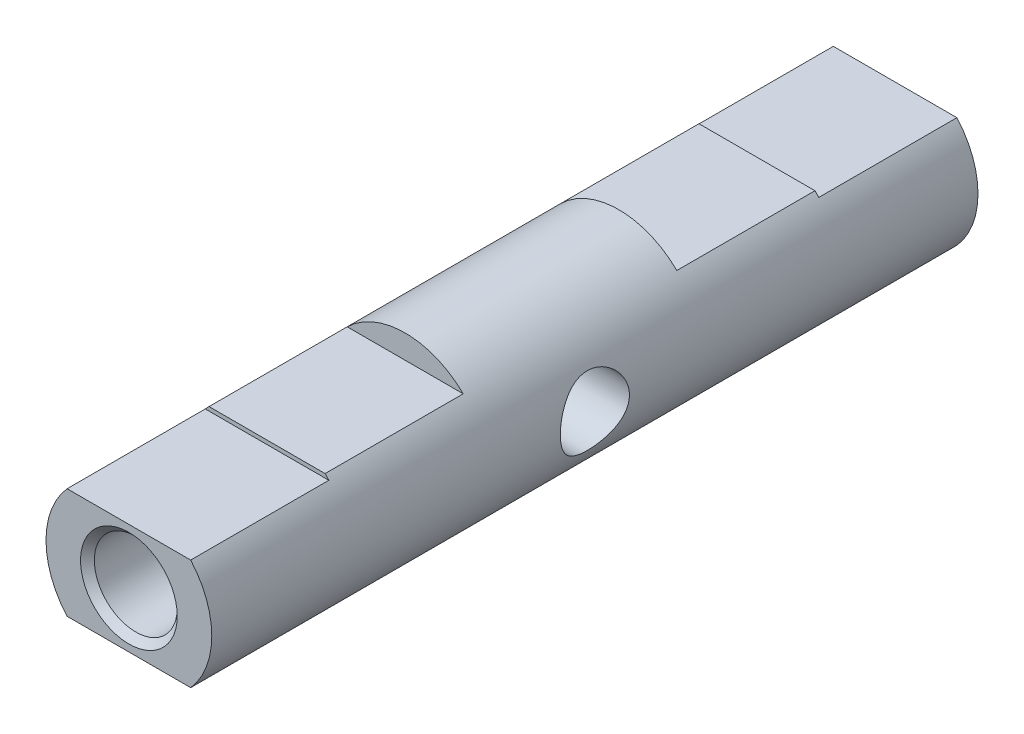
ISO-10303-21;
HEADER;
FILE_DESCRIPTION(('STEP AP214'),'2;1');
FILE_NAME('part.step','',(''),(''),'','','');
FILE_SCHEMA(('AUTOMOTIVE_DESIGN { 1 0 10303 214 1 1 1 1 }'));
ENDSEC;
DATA;
#1=APPLICATION_CONTEXT('core data for automotive mechanical design processes');
#2=APPLICATION_PROTOCOL_DEFINITION('international standard','automotive_design',2000,#1);
#3=PRODUCT_CONTEXT('',#1,'mechanical');
#4=PRODUCT('Part','Part','',(#3));
#5=PRODUCT_RELATED_PRODUCT_CATEGORY('part','',(#4));
#6=PRODUCT_DEFINITION_FORMATION('','',#4);
#7=PRODUCT_DEFINITION_CONTEXT('part definition',#1,'design');
#8=PRODUCT_DEFINITION('design','',#6,#7);
#9=PRODUCT_DEFINITION_SHAPE('','',#8);
#10=(LENGTH_UNIT() NAMED_UNIT(*) SI_UNIT(.MILLI.,.METRE.));
#11=(NAMED_UNIT(*) PLANE_ANGLE_UNIT() SI_UNIT($,.RADIAN.));
#12=(NAMED_UNIT(*) SI_UNIT($,.STERADIAN.) SOLID_ANGLE_UNIT());
#13=UNCERTAINTY_MEASURE_WITH_UNIT(LENGTH_MEASURE(1.E-05),#10,'distance_accuracy_value','');
#14=(GEOMETRIC_REPRESENTATION_CONTEXT(3) GLOBAL_UNCERTAINTY_ASSIGNED_CONTEXT((#13)) GLOBAL_UNIT_ASSIGNED_CONTEXT((#10,
#11,#12)) REPRESENTATION_CONTEXT('',''));
#15=CARTESIAN_POINT('',(0.,0.,0.));
#16=DIRECTION('',(0.,0.,1.));
#17=DIRECTION('',(1.,0.,0.));
#18=AXIS2_PLACEMENT_3D('',#15,#16,#17);
#19=CARTESIAN_POINT('',(0.,0.,-13.865));
#20=DIRECTION('',(0.,0.,1.));
#21=DIRECTION('',(1.,0.,0.));
#22=AXIS2_PLACEMENT_3D('',#19,#20,#21);
#23=CYLINDRICAL_SURFACE('',#22,3.);
#24=CARTESIAN_POINT('',(3.,0.,1.25));
#25=CARTESIAN_POINT('',(2.99999458367273,-0.0669580526362669,1.2499927949087));
#26=CARTESIAN_POINT('',(2.9977323297471,-0.134021397063841,1.24458804147187));
#27=CARTESIAN_POINT('',(2.98890153579552,-0.266247371156347,1.22316093507982));
#28=CARTESIAN_POINT('',(2.98232175901028,-0.331404576423565,1.20711087553575));
#29=CARTESIAN_POINT('',(2.96556289038127,-0.457688733653088,1.16508890821941));
#30=CARTESIAN_POINT('',(2.95539599975003,-0.518828524426269,1.13915061053185));
#31=CARTESIAN_POINT('',(2.93245286470664,-0.635829756679803,1.07822717676743));
#32=CARTESIAN_POINT('',(2.91967741092849,-0.69169279001594,1.04324478102913));
#33=CARTESIAN_POINT('',(2.89207828351869,-0.799448403559513,0.96337101740912));
#34=CARTESIAN_POINT('',(2.87718753326093,-0.851041267517769,0.918098691210248));
#35=CARTESIAN_POINT('',(2.84732714068513,-0.946159821091263,0.819735665217431));
#36=CARTESIAN_POINT('',(2.83235746106809,-0.989681263153086,0.766640875105494));
#37=CARTESIAN_POINT('',(2.80321021812995,-1.06953737697066,0.650973222435106));
#38=CARTESIAN_POINT('',(2.78910786873385,-1.10541308153925,0.588062551573457));
#39=CARTESIAN_POINT('',(2.76435572357005,-1.16593940588866,0.45642674207907));
#40=CARTESIAN_POINT('',(2.75370415000823,-1.19059580836291,0.387704620515548));
#41=CARTESIAN_POINT('',(2.73778555387705,-1.22674598312159,0.24984630823208));
#42=CARTESIAN_POINT('',(2.73228387651787,-1.23881657877606,0.180889516607846));
#43=CARTESIAN_POINT('',(2.72661326219504,-1.25125209967796,0.0417267073134295));
#44=CARTESIAN_POINT('',(2.72644138425259,-1.25162348054397,-0.0284786000257398));
#45=CARTESIAN_POINT('',(2.73125119560852,-1.24108450363674,-0.162400060434938));
#46=CARTESIAN_POINT('',(2.73583882723623,-1.23103681112301,-0.226201096564462));
#47=CARTESIAN_POINT('',(2.74898482773796,-1.20139191015777,-0.35111209100039));
#48=CARTESIAN_POINT('',(2.75754395703563,-1.18179287287177,-0.412221531491773));
#49=CARTESIAN_POINT('',(2.77786184772756,-1.13321958727571,-0.531557702991443));
#50=CARTESIAN_POINT('',(2.78968481949136,-1.10405471539236,-0.58969542091338));
#51=CARTESIAN_POINT('',(2.81518331141086,-1.03731242580562,-0.700477733880146));
#52=CARTESIAN_POINT('',(2.82885956129779,-0.999731690519545,-0.753120150613518));
#53=CARTESIAN_POINT('',(2.85792976877979,-0.913495965543836,-0.856099958732839));
#54=CARTESIAN_POINT('',(2.87337121404473,-0.864173483207527,-0.905866567385436));
#55=CARTESIAN_POINT('',(2.90325673112529,-0.757729591051513,-0.996613502959182));
#56=CARTESIAN_POINT('',(2.9177005687701,-0.700606359448458,-1.03759177169218));
#57=CARTESIAN_POINT('',(2.94438283556473,-0.578447948693377,-1.11043582361627));
#58=CARTESIAN_POINT('',(2.95656266543333,-0.513260582447681,-1.14206944515068));
#59=CARTESIAN_POINT('',(2.97689481414803,-0.377852402526832,-1.19372113960326));
#60=CARTESIAN_POINT('',(2.985049358458,-0.307634394795036,-1.21374563194382));
#61=CARTESIAN_POINT('',(2.99599641186385,-0.168928113346229,-1.24041599212664));
#62=CARTESIAN_POINT('',(2.99909541047125,-0.10061128527864,-1.24782785744375));
#63=CARTESIAN_POINT('',(3.00056050368745,0.0363546554960889,-1.25134622361409));
#64=CARTESIAN_POINT('',(2.99892795711939,0.105003667152635,-1.247455970252));
#65=CARTESIAN_POINT('',(2.9913121765694,0.237098242341435,-1.22902891519393));
#66=CARTESIAN_POINT('',(2.98554887283989,0.300632966639387,-1.2150300459028));
#67=CARTESIAN_POINT('',(2.97048606772414,0.424382748971091,-1.17753180545922));
#68=CARTESIAN_POINT('',(2.96118611959704,0.484597386518361,-1.1540312340497));
#69=CARTESIAN_POINT('',(2.93958270645166,0.602108999869137,-1.09742902428788));
#70=CARTESIAN_POINT('',(2.92719491469281,0.659257236855324,-1.06405181685397));
#71=CARTESIAN_POINT('',(2.9007380457909,0.76734621623143,-0.988946622208306));
#72=CARTESIAN_POINT('',(2.88666826768733,0.818284352601942,-0.947215148470727));
#73=CARTESIAN_POINT('',(2.85712087895437,0.916333430274265,-0.853096766727593));
#74=CARTESIAN_POINT('',(2.84161451591029,0.962910697979836,-0.80016149701374));
#75=CARTESIAN_POINT('',(2.81184336768005,1.04666984610551,-0.686978724064608));
#76=CARTESIAN_POINT('',(2.79757886493438,1.08384959285617,-0.626729564828267));
#77=CARTESIAN_POINT('',(2.77181386243988,1.14815960208699,-0.499385824697424));
#78=CARTESIAN_POINT('',(2.76035562555111,1.17513918237329,-0.43220596448517));
#79=CARTESIAN_POINT('',(2.74208355658957,1.21717413951573,-0.293629406189895));
#80=CARTESIAN_POINT('',(2.73526589555752,1.23223934863688,-0.222236237516652));
#81=CARTESIAN_POINT('',(2.72763164537264,1.24904080348901,-0.0831813008007906));
#82=CARTESIAN_POINT('',(2.72639350967162,1.25171380413129,-0.0156553377073847));
#83=CARTESIAN_POINT('',(2.72893853011024,1.24615575523912,0.118842861141101));
#84=CARTESIAN_POINT('',(2.73272091540306,1.23792637964722,0.185815180313694));
#85=CARTESIAN_POINT('',(2.74449551302268,1.21158404780491,0.31409274746889));
#86=CARTESIAN_POINT('',(2.7522835484648,1.19394903571466,0.375516673463392));
#87=CARTESIAN_POINT('',(2.77103181199189,1.14976328202135,0.494548021357227));
#88=CARTESIAN_POINT('',(2.78199293131693,1.12321003517252,0.552154365398783));
#89=CARTESIAN_POINT('',(2.80666954560013,1.0601028593549,0.665695895949123));
#90=CARTESIAN_POINT('',(2.82051102713679,1.02304360910483,0.72132233016829));
#91=CARTESIAN_POINT('',(2.84903689053839,0.940684072630392,0.82586013936068));
#92=CARTESIAN_POINT('',(2.86372156345875,0.89538092890562,0.874769175600573));
#93=CARTESIAN_POINT('',(2.89356392850106,0.793902045778821,0.968148681684744));
#94=CARTESIAN_POINT('',(2.90867817511791,0.737174739949028,1.01203643284065));
#95=CARTESIAN_POINT('',(2.9366014362202,0.616600079253199,1.08969945354363));
#96=CARTESIAN_POINT('',(2.9494093991674,0.552749497945746,1.12347011488956));
#97=CARTESIAN_POINT('',(2.97109183362461,0.42073205671795,1.17920984543989));
#98=CARTESIAN_POINT('',(2.98002782581964,0.352653990980636,1.2013647666173));
#99=CARTESIAN_POINT('',(2.99321009768625,0.213410421846558,1.23370632907784));
#100=CARTESIAN_POINT('',(2.99747105811967,0.142255316980957,1.24393044252989));
#101=CARTESIAN_POINT('',(2.99972287568934,0.0472360819191833,1.24933316108645));
#102=CARTESIAN_POINT('',(3.00000191102536,0.0236245946756571,1.25000254214922));
#103=CARTESIAN_POINT('',(3.,0.,1.25));
#104=B_SPLINE_CURVE_WITH_KNOTS('',3,(#24,#25,#26,#27,#28,#29,#30,#31,#32,#33,#34,#35,#36,#37,
#38,#39,#40,#41,#42,#43,#44,#45,#46,#47,#48,#49,#50,#51,#52,#53,#54,#55,#56,#57,#58,#59,#60,#61,
#62,#63,#64,#65,#66,#67,#68,#69,#70,#71,#72,#73,#74,#75,#76,#77,#78,#79,#80,#81,#82,#83,#84,#85,
#86,#87,#88,#89,#90,#91,#92,#93,#94,#95,#96,#97,#98,#99,#100,#101,#102,#103),.UNSPECIFIED.,.T.,
.F.,(4,2,2,2,2,2,2,2,2,2,2,2,2,2,2,2,2,2,2,2,2,2,2,2,2,2,2,2,2,2,2,2,2,2,2,2,2,2,2,4),(0.,
0.200806918883939,0.402138540628697,0.602791851906302,0.803384436852975,1.01317936288807,
1.22308438131466,1.44331724539125,1.66343646730588,1.87295273137558,2.08235338249046,
2.27570157202557,2.46908679727213,2.66658713058715,2.86416545717207,3.07844141127897,
3.29276749314588,3.51204055060813,3.73119224218297,3.93648443393251,4.14171767493172,
4.33676589735722,4.53183876601785,4.73297135272161,4.93418805469496,5.14978488029295,
5.36543061240342,5.58414788359524,5.80268447074581,6.00439877559644,6.20608211297537,
6.39837649964763,6.59072494950613,6.79463893397442,6.99862373425944,7.2174653500489,
7.43640649428583,7.65172855819386,7.86637250469322,7.93722256499098),.UNSPECIFIED.);
#105=CARTESIAN_POINT('',(3.,0.,1.25));
#106=VERTEX_POINT('',#105);
#107=EDGE_CURVE('E156',#106,#106,#104,.T.);
#108=ORIENTED_EDGE('',*,*,#107,.F.);
#109=EDGE_LOOP('',(#108));
#110=FACE_BOUND('',#109,.T.);
#111=DIRECTION('',(0.,0.,1.));
#112=VECTOR('',#111,1.);
#113=CARTESIAN_POINT('',(-2.34,1.87733854165944,-13.865));
#114=LINE('',#113,#112);
#115=CARTESIAN_POINT('',(-2.34,1.87733854165944,3.7));
#116=VERTEX_POINT('',#115);
#117=CARTESIAN_POINT('',(-2.34,1.87733854165944,-3.7));
#118=VERTEX_POINT('',#117);
#119=EDGE_CURVE('E11',#116,#118,#114,.F.);
#120=ORIENTED_EDGE('',*,*,#119,.F.);
#121=CARTESIAN_POINT('',(0.,0.,3.7));
#122=DIRECTION('',(0.,0.,-1.));
#123=DIRECTION('',(-1.,0.,0.));
#124=AXIS2_PLACEMENT_3D('',#121,#122,#123);
#125=CIRCLE('',#124,3.);
#126=CARTESIAN_POINT('',(-2.34,-1.87733854165944,3.7));
#127=VERTEX_POINT('',#126);
#128=EDGE_CURVE('E47',#116,#127,#125,.F.);
#129=ORIENTED_EDGE('',*,*,#128,.T.);
#130=DIRECTION('',(0.,0.,1.));
#131=VECTOR('',#130,1.);
#132=CARTESIAN_POINT('',(-2.34,-1.87733854165944,-13.865));
#133=LINE('',#132,#131);
#134=CARTESIAN_POINT('',(-2.34,-1.87733854165944,-3.7));
#135=VERTEX_POINT('',#134);
#136=EDGE_CURVE('E151',#135,#127,#133,.T.);
#137=ORIENTED_EDGE('',*,*,#136,.F.);
#138=CARTESIAN_POINT('',(0.,0.,-3.7));
#139=DIRECTION('',(0.,0.,1.));
#140=DIRECTION('',(0.,-1.,0.));
#141=AXIS2_PLACEMENT_3D('',#138,#139,#140);
#142=CIRCLE('',#141,3.);
#143=EDGE_CURVE('E152',#135,#118,#142,.F.);
#144=ORIENTED_EDGE('',*,*,#143,.T.);
#145=EDGE_LOOP('',(#120,#129,#137,#144));
#146=FACE_BOUND('',#145,.T.);
#147=CARTESIAN_POINT('',(0.,0.,-3.865));
#148=DIRECTION('',(0.,0.,-1.));
#149=DIRECTION('',(-1.,0.,0.));
#150=AXIS2_PLACEMENT_3D('',#147,#148,#149);
#151=CIRCLE('',#150,3.);
#152=CARTESIAN_POINT('',(-2.1,2.14242852856285,-3.865));
#153=VERTEX_POINT('',#152);
#154=CARTESIAN_POINT('',(2.1,2.14242852856285,-3.865));
#155=VERTEX_POINT('',#154);
#156=EDGE_CURVE('E226',#153,#155,#151,.T.);
#157=ORIENTED_EDGE('',*,*,#156,.F.);
#158=DIRECTION('',(0.,0.,-1.));
#159=VECTOR('',#158,1.);
#160=CARTESIAN_POINT('',(-2.1,2.14242852856285,-3.865));
#161=LINE('',#160,#159);
#162=CARTESIAN_POINT('',(-2.1,2.14242852856285,-8.865));
#163=VERTEX_POINT('',#162);
#164=EDGE_CURVE('E206',#153,#163,#161,.T.);
#165=ORIENTED_EDGE('',*,*,#164,.T.);
#166=CARTESIAN_POINT('',(0.,0.,-8.865));
#167=DIRECTION('',(0.,0.,-1.));
#168=DIRECTION('',(-1.,0.,0.));
#169=AXIS2_PLACEMENT_3D('',#166,#167,#168);
#170=CIRCLE('',#169,3.);
#171=CARTESIAN_POINT('',(-2.23606797749979,2.,-8.865));
#172=VERTEX_POINT('',#171);
#173=EDGE_CURVE('E217',#172,#163,#170,.T.);
#174=ORIENTED_EDGE('',*,*,#173,.F.);
#175=DIRECTION('',(0.,0.,-1.));
#176=VECTOR('',#175,1.);
#177=CARTESIAN_POINT('',(-2.23606797749979,2.,-8.865));
#178=LINE('',#177,#176);
#179=CARTESIAN_POINT('',(-2.23606797749979,2.,-13.865));
#180=VERTEX_POINT('',#179);
#181=EDGE_CURVE('E183',#172,#180,#178,.T.);
#182=ORIENTED_EDGE('',*,*,#181,.T.);
#183=CARTESIAN_POINT('',(0.,0.,-13.865));
#184=DIRECTION('',(0.,0.,1.));
#185=DIRECTION('',(1.,0.,0.));
#186=AXIS2_PLACEMENT_3D('',#183,#184,#185);
#187=CIRCLE('',#186,3.);
#188=CARTESIAN_POINT('',(-2.23606797749979,-2.,-13.865));
#189=VERTEX_POINT('',#188);
#190=EDGE_CURVE('E162',#180,#189,#187,.T.);
#191=ORIENTED_EDGE('',*,*,#190,.T.);
#192=DIRECTION('',(0.,0.,-1.));
#193=VECTOR('',#192,1.);
#194=CARTESIAN_POINT('',(-2.23606797749979,-2.,-8.865));
#195=LINE('',#194,#193);
#196=CARTESIAN_POINT('',(-2.23606797749979,-2.,-8.865));
#197=VERTEX_POINT('',#196);
#198=EDGE_CURVE('E205',#197,#189,#195,.T.);
#199=ORIENTED_EDGE('',*,*,#198,.F.);
#200=CARTESIAN_POINT('',(0.,0.,-8.865));
#201=DIRECTION('',(0.,0.,-1.));
#202=DIRECTION('',(-1.,0.,0.));
#203=AXIS2_PLACEMENT_3D('',#200,#201,#202);
#204=CIRCLE('',#203,3.);
#205=CARTESIAN_POINT('',(2.23606797749979,-2.,-8.865));
#206=VERTEX_POINT('',#205);
#207=EDGE_CURVE('E199',#206,#197,#204,.T.);
#208=ORIENTED_EDGE('',*,*,#207,.F.);
#209=DIRECTION('',(0.,0.,-1.));
#210=VECTOR('',#209,1.);
#211=CARTESIAN_POINT('',(2.23606797749979,-2.,-8.865));
#212=LINE('',#211,#210);
#213=CARTESIAN_POINT('',(2.23606797749979,-2.,-13.865));
#214=VERTEX_POINT('',#213);
#215=EDGE_CURVE('E204',#206,#214,#212,.T.);
#216=ORIENTED_EDGE('',*,*,#215,.T.);
#217=CARTESIAN_POINT('',(2.23606797749979,2.,-13.865));
#218=VERTEX_POINT('',#217);
#219=EDGE_CURVE('E164',#214,#218,#187,.T.);
#220=ORIENTED_EDGE('',*,*,#219,.T.);
#221=DIRECTION('',(0.,0.,-1.));
#222=VECTOR('',#221,1.);
#223=CARTESIAN_POINT('',(2.23606797749979,2.,-8.865));
#224=LINE('',#223,#222);
#225=CARTESIAN_POINT('',(2.23606797749979,2.,-8.865));
#226=VERTEX_POINT('',#225);
#227=EDGE_CURVE('E208',#226,#218,#224,.T.);
#228=ORIENTED_EDGE('',*,*,#227,.F.);
#229=CARTESIAN_POINT('',(2.1,2.14242852856285,-8.865));
#230=VERTEX_POINT('',#229);
#231=EDGE_CURVE('E218',#230,#226,#170,.T.);
#232=ORIENTED_EDGE('',*,*,#231,.F.);
#233=DIRECTION('',(0.,0.,-1.));
#234=VECTOR('',#233,1.);
#235=CARTESIAN_POINT('',(2.1,2.14242852856285,-3.865));
#236=LINE('',#235,#234);
#237=EDGE_CURVE('E221',#155,#230,#236,.T.);
#238=ORIENTED_EDGE('',*,*,#237,.F.);
#239=EDGE_LOOP('',(#157,#165,#174,#182,#191,#199,#208,#216,#220,#228,#232,#238));
#240=FACE_BOUND('',#239,.T.);
#241=CARTESIAN_POINT('',(0.,0.,3.865));
#242=DIRECTION('',(0.,0.,1.));
#243=DIRECTION('',(1.,0.,0.));
#244=AXIS2_PLACEMENT_3D('',#241,#242,#243);
#245=CIRCLE('',#244,3.);
#246=CARTESIAN_POINT('',(2.1,2.14242852856285,3.865));
#247=VERTEX_POINT('',#246);
#248=CARTESIAN_POINT('',(-2.1,2.14242852856285,3.865));
#249=VERTEX_POINT('',#248);
#250=EDGE_CURVE('E238',#247,#249,#245,.T.);
#251=ORIENTED_EDGE('',*,*,#250,.F.);
#252=DIRECTION('',(0.,0.,1.));
#253=VECTOR('',#252,1.);
#254=CARTESIAN_POINT('',(2.1,2.14242852856285,3.865));
#255=LINE('',#254,#253);
#256=CARTESIAN_POINT('',(2.1,2.14242852856285,8.865));
#257=VERTEX_POINT('',#256);
#258=EDGE_CURVE('E230',#247,#257,#255,.T.);
#259=ORIENTED_EDGE('',*,*,#258,.T.);
#260=CARTESIAN_POINT('',(0.,0.,8.865));
#261=DIRECTION('',(0.,0.,1.));
#262=DIRECTION('',(1.,0.,0.));
#263=AXIS2_PLACEMENT_3D('',#260,#261,#262);
#264=CIRCLE('',#263,3.);
#265=CARTESIAN_POINT('',(2.23606797749979,2.,8.865));
#266=VERTEX_POINT('',#265);
#267=EDGE_CURVE('E193',#266,#257,#264,.T.);
#268=ORIENTED_EDGE('',*,*,#267,.F.);
#269=DIRECTION('',(0.,0.,1.));
#270=VECTOR('',#269,1.);
#271=CARTESIAN_POINT('',(2.23606797749979,2.,8.865));
#272=LINE('',#271,#270);
#273=CARTESIAN_POINT('',(2.23606797749979,2.,13.865));
#274=VERTEX_POINT('',#273);
#275=EDGE_CURVE('E175',#266,#274,#272,.T.);
#276=ORIENTED_EDGE('',*,*,#275,.T.);
#277=CARTESIAN_POINT('',(0.,0.,13.865));
#278=DIRECTION('',(0.,0.,1.));
#279=DIRECTION('',(1.,0.,0.));
#280=AXIS2_PLACEMENT_3D('',#277,#278,#279);
#281=CIRCLE('',#280,3.);
#282=CARTESIAN_POINT('',(2.23606797749979,-2.,13.865));
#283=VERTEX_POINT('',#282);
#284=EDGE_CURVE('E169',#283,#274,#281,.T.);
#285=ORIENTED_EDGE('',*,*,#284,.F.);
#286=DIRECTION('',(0.,0.,1.));
#287=VECTOR('',#286,1.);
#288=CARTESIAN_POINT('',(2.23606797749979,-2.,8.865));
#289=LINE('',#288,#287);
#290=CARTESIAN_POINT('',(2.23606797749979,-2.,8.865));
#291=VERTEX_POINT('',#290);
#292=EDGE_CURVE('E178',#291,#283,#289,.T.);
#293=ORIENTED_EDGE('',*,*,#292,.F.);
#294=CARTESIAN_POINT('',(0.,0.,8.865));
#295=DIRECTION('',(0.,0.,1.));
#296=DIRECTION('',(1.,0.,0.));
#297=AXIS2_PLACEMENT_3D('',#294,#295,#296);
#298=CIRCLE('',#297,3.);
#299=CARTESIAN_POINT('',(-2.23606797749979,-2.,8.865));
#300=VERTEX_POINT('',#299);
#301=EDGE_CURVE('E173',#300,#291,#298,.T.);
#302=ORIENTED_EDGE('',*,*,#301,.F.);
#303=DIRECTION('',(0.,0.,1.));
#304=VECTOR('',#303,1.);
#305=CARTESIAN_POINT('',(-2.23606797749979,-2.,8.865));
#306=LINE('',#305,#304);
#307=CARTESIAN_POINT('',(-2.23606797749979,-2.,13.865));
#308=VERTEX_POINT('',#307);
#309=EDGE_CURVE('E181',#300,#308,#306,.T.);
#310=ORIENTED_EDGE('',*,*,#309,.T.);
#311=CARTESIAN_POINT('',(-2.23606797749979,2.,13.865));
#312=VERTEX_POINT('',#311);
#313=EDGE_CURVE('E166',#312,#308,#281,.T.);
#314=ORIENTED_EDGE('',*,*,#313,.F.);
#315=DIRECTION('',(0.,0.,1.));
#316=VECTOR('',#315,1.);
#317=CARTESIAN_POINT('',(-2.23606797749979,2.,8.865));
#318=LINE('',#317,#316);
#319=CARTESIAN_POINT('',(-2.23606797749979,2.,8.865));
#320=VERTEX_POINT('',#319);
#321=EDGE_CURVE('E187',#320,#312,#318,.T.);
#322=ORIENTED_EDGE('',*,*,#321,.F.);
#323=CARTESIAN_POINT('',(-2.1,2.14242852856285,8.865));
#324=VERTEX_POINT('',#323);
#325=EDGE_CURVE('E195',#324,#320,#264,.T.);
#326=ORIENTED_EDGE('',*,*,#325,.F.);
#327=DIRECTION('',(0.,0.,1.));
#328=VECTOR('',#327,1.);
#329=CARTESIAN_POINT('',(-2.1,2.14242852856285,3.865));
#330=LINE('',#329,#328);
#331=EDGE_CURVE('E235',#249,#324,#330,.T.);
#332=ORIENTED_EDGE('',*,*,#331,.F.);
#333=EDGE_LOOP('',(#251,#259,#268,#276,#285,#293,#302,#310,#314,#322,#326,#332));
#334=FACE_BOUND('',#333,.T.);
#335=ADVANCED_FACE('F41',(#110,#146,#240,#334),#23,.T.);
#336=CARTESIAN_POINT('',(0.,0.,-13.865));
#337=DIRECTION('',(0.,0.,1.));
#338=DIRECTION('',(1.,0.,0.));
#339=AXIS2_PLACEMENT_3D('',#336,#337,#338);
#340=PLANE('',#339);
#341=CARTESIAN_POINT('',(0.,0.,-13.865));
#342=DIRECTION('',(0.,0.,-1.));
#343=DIRECTION('',(-1.,0.,0.));
#344=AXIS2_PLACEMENT_3D('',#341,#342,#343);
#345=CIRCLE('',#344,1.75);
#346=CARTESIAN_POINT('',(-1.75,0.,-13.865));
#347=VERTEX_POINT('',#346);
#348=EDGE_CURVE('E250',#347,#347,#345,.T.);
#349=ORIENTED_EDGE('',*,*,#348,.F.);
#350=EDGE_LOOP('',(#349));
#351=FACE_BOUND('',#350,.T.);
#352=DIRECTION('',(-1.,0.,0.));
#353=VECTOR('',#352,1.);
#354=CARTESIAN_POINT('',(2.23606797749979,2.,-13.865));
#355=LINE('',#354,#353);
#356=EDGE_CURVE('E203',#218,#180,#355,.T.);
#357=ORIENTED_EDGE('',*,*,#356,.F.);
#358=ORIENTED_EDGE('',*,*,#219,.F.);
#359=DIRECTION('',(1.,0.,0.));
#360=VECTOR('',#359,1.);
#361=CARTESIAN_POINT('',(2.23606797749979,-2.,-13.865));
#362=LINE('',#361,#360);
#363=EDGE_CURVE('E200',#189,#214,#362,.T.);
#364=ORIENTED_EDGE('',*,*,#363,.F.);
#365=ORIENTED_EDGE('',*,*,#190,.F.);
#366=EDGE_LOOP('',(#357,#358,#364,#365));
#367=FACE_BOUND('',#366,.T.);
#368=ADVANCED_FACE('F352',(#351,#367),#340,.F.);
#369=CARTESIAN_POINT('',(0.,0.,13.865));
#370=DIRECTION('',(0.,0.,1.));
#371=DIRECTION('',(1.,0.,0.));
#372=AXIS2_PLACEMENT_3D('',#369,#370,#371);
#373=PLANE('',#372);
#374=CARTESIAN_POINT('',(0.,0.,13.865));
#375=DIRECTION('',(0.,0.,1.));
#376=DIRECTION('',(1.,0.,0.));
#377=AXIS2_PLACEMENT_3D('',#374,#375,#376);
#378=CIRCLE('',#377,1.75);
#379=CARTESIAN_POINT('',(1.75,0.,13.865));
#380=VERTEX_POINT('',#379);
#381=EDGE_CURVE('E256',#380,#380,#378,.T.);
#382=ORIENTED_EDGE('',*,*,#381,.F.);
#383=EDGE_LOOP('',(#382));
#384=FACE_BOUND('',#383,.T.);
#385=DIRECTION('',(1.,0.,0.));
#386=VECTOR('',#385,1.);
#387=CARTESIAN_POINT('',(-2.23606797749979,2.,13.865));
#388=LINE('',#387,#386);
#389=EDGE_CURVE('E179',#312,#274,#388,.T.);
#390=ORIENTED_EDGE('',*,*,#389,.F.);
#391=ORIENTED_EDGE('',*,*,#313,.T.);
#392=DIRECTION('',(-1.,0.,0.));
#393=VECTOR('',#392,1.);
#394=CARTESIAN_POINT('',(-2.23606797749979,-2.,13.865));
#395=LINE('',#394,#393);
#396=EDGE_CURVE('E174',#283,#308,#395,.T.);
#397=ORIENTED_EDGE('',*,*,#396,.F.);
#398=ORIENTED_EDGE('',*,*,#284,.T.);
#399=EDGE_LOOP('',(#390,#391,#397,#398));
#400=FACE_BOUND('',#399,.T.);
#401=ADVANCED_FACE('F349',(#384,#400),#373,.T.);
#402=CARTESIAN_POINT('',(-2.23606797749979,-2.,8.865));
#403=DIRECTION('',(0.,1.,0.));
#404=DIRECTION('',(0.,0.,1.));
#405=AXIS2_PLACEMENT_3D('',#402,#403,#404);
#406=PLANE('',#405);
#407=ORIENTED_EDGE('',*,*,#396,.T.);
#408=ORIENTED_EDGE('',*,*,#309,.F.);
#409=DIRECTION('',(-1.,0.,0.));
#410=VECTOR('',#409,1.);
#411=CARTESIAN_POINT('',(-2.23606797749979,-2.,8.865));
#412=LINE('',#411,#410);
#413=EDGE_CURVE('E176',#291,#300,#412,.T.);
#414=ORIENTED_EDGE('',*,*,#413,.F.);
#415=ORIENTED_EDGE('',*,*,#292,.T.);
#416=EDGE_LOOP('',(#407,#408,#414,#415));
#417=FACE_BOUND('',#416,.T.);
#418=ADVANCED_FACE('F343',(#417),#406,.F.);
#419=CARTESIAN_POINT('',(0.,0.,8.865));
#420=DIRECTION('',(0.,0.,1.));
#421=DIRECTION('',(1.,0.,0.));
#422=AXIS2_PLACEMENT_3D('',#419,#420,#421);
#423=PLANE('',#422);
#424=ORIENTED_EDGE('',*,*,#301,.T.);
#425=ORIENTED_EDGE('',*,*,#413,.T.);
#426=EDGE_LOOP('',(#424,#425));
#427=FACE_BOUND('',#426,.T.);
#428=ADVANCED_FACE('F345',(#427),#423,.T.);
#429=CARTESIAN_POINT('',(-2.23606797749979,2.,8.865));
#430=DIRECTION('',(0.,-1.,0.));
#431=DIRECTION('',(0.,0.,-1.));
#432=AXIS2_PLACEMENT_3D('',#429,#430,#431);
#433=PLANE('',#432);
#434=ORIENTED_EDGE('',*,*,#389,.T.);
#435=ORIENTED_EDGE('',*,*,#275,.F.);
#436=DIRECTION('',(1.,0.,0.));
#437=VECTOR('',#436,1.);
#438=CARTESIAN_POINT('',(-2.23606797749979,2.,8.865));
#439=LINE('',#438,#437);
#440=EDGE_CURVE('E189',#320,#266,#439,.T.);
#441=ORIENTED_EDGE('',*,*,#440,.F.);
#442=ORIENTED_EDGE('',*,*,#321,.T.);
#443=EDGE_LOOP('',(#434,#435,#441,#442));
#444=FACE_BOUND('',#443,.T.);
#445=ADVANCED_FACE('F336',(#444),#433,.F.);
#446=CARTESIAN_POINT('',(0.,0.,8.865));
#447=DIRECTION('',(0.,0.,1.));
#448=DIRECTION('',(1.,0.,0.));
#449=AXIS2_PLACEMENT_3D('',#446,#447,#448);
#450=PLANE('',#449);
#451=DIRECTION('',(1.,0.,0.));
#452=VECTOR('',#451,1.);
#453=CARTESIAN_POINT('',(-2.1,2.14242852856285,8.865));
#454=LINE('',#453,#452);
#455=EDGE_CURVE('E236',#324,#257,#454,.T.);
#456=ORIENTED_EDGE('',*,*,#455,.F.);
#457=ORIENTED_EDGE('',*,*,#325,.T.);
#458=ORIENTED_EDGE('',*,*,#440,.T.);
#459=ORIENTED_EDGE('',*,*,#267,.T.);
#460=EDGE_LOOP('',(#456,#457,#458,#459));
#461=FACE_BOUND('',#460,.T.);
#462=ADVANCED_FACE('F331',(#461),#450,.T.);
#463=CARTESIAN_POINT('',(2.23606797749979,-2.,-8.865));
#464=DIRECTION('',(0.,1.,0.));
#465=DIRECTION('',(0.,0.,1.));
#466=AXIS2_PLACEMENT_3D('',#463,#464,#465);
#467=PLANE('',#466);
#468=ORIENTED_EDGE('',*,*,#363,.T.);
#469=ORIENTED_EDGE('',*,*,#215,.F.);
#470=DIRECTION('',(1.,0.,0.));
#471=VECTOR('',#470,1.);
#472=CARTESIAN_POINT('',(2.23606797749979,-2.,-8.865));
#473=LINE('',#472,#471);
#474=EDGE_CURVE('E196',#197,#206,#473,.T.);
#475=ORIENTED_EDGE('',*,*,#474,.F.);
#476=ORIENTED_EDGE('',*,*,#198,.T.);
#477=EDGE_LOOP('',(#468,#469,#475,#476));
#478=FACE_BOUND('',#477,.T.);
#479=ADVANCED_FACE('F327',(#478),#467,.F.);
#480=CARTESIAN_POINT('',(0.,0.,-8.865));
#481=DIRECTION('',(0.,0.,-1.));
#482=DIRECTION('',(-1.,0.,0.));
#483=AXIS2_PLACEMENT_3D('',#480,#481,#482);
#484=PLANE('',#483);
#485=ORIENTED_EDGE('',*,*,#207,.T.);
#486=ORIENTED_EDGE('',*,*,#474,.T.);
#487=EDGE_LOOP('',(#485,#486));
#488=FACE_BOUND('',#487,.T.);
#489=ADVANCED_FACE('F328',(#488),#484,.T.);
#490=CARTESIAN_POINT('',(2.23606797749979,2.,-8.865));
#491=DIRECTION('',(0.,-1.,0.));
#492=DIRECTION('',(0.,0.,-1.));
#493=AXIS2_PLACEMENT_3D('',#490,#491,#492);
#494=PLANE('',#493);
#495=ORIENTED_EDGE('',*,*,#356,.T.);
#496=ORIENTED_EDGE('',*,*,#181,.F.);
#497=DIRECTION('',(-1.,0.,0.));
#498=VECTOR('',#497,1.);
#499=CARTESIAN_POINT('',(2.23606797749979,2.,-8.865));
#500=LINE('',#499,#498);
#501=EDGE_CURVE('E215',#226,#172,#500,.T.);
#502=ORIENTED_EDGE('',*,*,#501,.F.);
#503=ORIENTED_EDGE('',*,*,#227,.T.);
#504=EDGE_LOOP('',(#495,#496,#502,#503));
#505=FACE_BOUND('',#504,.T.);
#506=ADVANCED_FACE('F325',(#505),#494,.F.);
#507=CARTESIAN_POINT('',(0.,0.,-8.865));
#508=DIRECTION('',(0.,0.,-1.));
#509=DIRECTION('',(-1.,0.,0.));
#510=AXIS2_PLACEMENT_3D('',#507,#508,#509);
#511=PLANE('',#510);
#512=DIRECTION('',(-1.,0.,0.));
#513=VECTOR('',#512,1.);
#514=CARTESIAN_POINT('',(2.1,2.14242852856285,-8.865));
#515=LINE('',#514,#513);
#516=EDGE_CURVE('E228',#230,#163,#515,.T.);
#517=ORIENTED_EDGE('',*,*,#516,.F.);
#518=ORIENTED_EDGE('',*,*,#231,.T.);
#519=ORIENTED_EDGE('',*,*,#501,.T.);
#520=ORIENTED_EDGE('',*,*,#173,.T.);
#521=EDGE_LOOP('',(#517,#518,#519,#520));
#522=FACE_BOUND('',#521,.T.);
#523=ADVANCED_FACE('F319',(#522),#511,.T.);
#524=CARTESIAN_POINT('',(2.1,2.14242852856285,-3.865));
#525=DIRECTION('',(0.,-1.,0.));
#526=DIRECTION('',(0.,0.,-1.));
#527=AXIS2_PLACEMENT_3D('',#524,#525,#526);
#528=PLANE('',#527);
#529=ORIENTED_EDGE('',*,*,#516,.T.);
#530=ORIENTED_EDGE('',*,*,#164,.F.);
#531=DIRECTION('',(-1.,0.,0.));
#532=VECTOR('',#531,1.);
#533=CARTESIAN_POINT('',(2.1,2.14242852856285,-3.865));
#534=LINE('',#533,#532);
#535=EDGE_CURVE('E222',#155,#153,#534,.T.);
#536=ORIENTED_EDGE('',*,*,#535,.F.);
#537=ORIENTED_EDGE('',*,*,#237,.T.);
#538=EDGE_LOOP('',(#529,#530,#536,#537));
#539=FACE_BOUND('',#538,.T.);
#540=ADVANCED_FACE('F313',(#539),#528,.F.);
#541=CARTESIAN_POINT('',(0.,0.,-3.865));
#542=DIRECTION('',(0.,0.,-1.));
#543=DIRECTION('',(-1.,0.,0.));
#544=AXIS2_PLACEMENT_3D('',#541,#542,#543);
#545=PLANE('',#544);
#546=ORIENTED_EDGE('',*,*,#156,.T.);
#547=ORIENTED_EDGE('',*,*,#535,.T.);
#548=EDGE_LOOP('',(#546,#547));
#549=FACE_BOUND('',#548,.T.);
#550=ADVANCED_FACE('F309',(#549),#545,.T.);
#551=CARTESIAN_POINT('',(-2.1,2.14242852856285,3.865));
#552=DIRECTION('',(0.,-1.,0.));
#553=DIRECTION('',(0.,0.,-1.));
#554=AXIS2_PLACEMENT_3D('',#551,#552,#553);
#555=PLANE('',#554);
#556=ORIENTED_EDGE('',*,*,#455,.T.);
#557=ORIENTED_EDGE('',*,*,#258,.F.);
#558=DIRECTION('',(1.,0.,0.));
#559=VECTOR('',#558,1.);
#560=CARTESIAN_POINT('',(-2.1,2.14242852856285,3.865));
#561=LINE('',#560,#559);
#562=EDGE_CURVE('E65',#249,#247,#561,.T.);
#563=ORIENTED_EDGE('',*,*,#562,.F.);
#564=ORIENTED_EDGE('',*,*,#331,.T.);
#565=EDGE_LOOP('',(#556,#557,#563,#564));
#566=FACE_BOUND('',#565,.T.);
#567=ADVANCED_FACE('F310',(#566),#555,.F.);
#568=CARTESIAN_POINT('',(0.,0.,3.865));
#569=DIRECTION('',(0.,0.,1.));
#570=DIRECTION('',(1.,0.,0.));
#571=AXIS2_PLACEMENT_3D('',#568,#569,#570);
#572=PLANE('',#571);
#573=ORIENTED_EDGE('',*,*,#250,.T.);
#574=ORIENTED_EDGE('',*,*,#562,.T.);
#575=EDGE_LOOP('',(#573,#574));
#576=FACE_BOUND('',#575,.T.);
#577=ADVANCED_FACE('F303',(#576),#572,.T.);
#578=CARTESIAN_POINT('',(0.,0.,-4.76629092854134));
#579=DIRECTION('',(0.,0.,-1.));
#580=DIRECTION('',(-1.,0.,0.));
#581=AXIS2_PLACEMENT_3D('',#578,#579,#580);
#582=CONICAL_SURFACE('',#581,1.5,1.02974425867665);
#583=CARTESIAN_POINT('',(0.,0.,-3.865));
#584=VERTEX_POINT('',#583);
#585=VERTEX_LOOP('',#584);
#586=FACE_BOUND('',#585,.T.);
#587=CARTESIAN_POINT('',(0.,0.,-4.76629092854134));
#588=DIRECTION('',(0.,0.,-1.));
#589=DIRECTION('',(-1.,0.,0.));
#590=AXIS2_PLACEMENT_3D('',#587,#588,#589);
#591=CIRCLE('',#590,1.5);
#592=CARTESIAN_POINT('',(-1.5,0.,-4.76629092854134));
#593=VERTEX_POINT('',#592);
#594=EDGE_CURVE('E237',#593,#593,#591,.T.);
#595=ORIENTED_EDGE('',*,*,#594,.T.);
#596=EDGE_LOOP('',(#595));
#597=FACE_BOUND('',#596,.T.);
#598=ADVANCED_FACE('F299',(#586,#597),#582,.F.);
#599=CARTESIAN_POINT('',(0.,0.,-13.865));
#600=DIRECTION('',(0.,0.,-1.));
#601=DIRECTION('',(-1.,0.,0.));
#602=AXIS2_PLACEMENT_3D('',#599,#600,#601);
#603=CYLINDRICAL_SURFACE('',#602,1.5);
#604=ORIENTED_EDGE('',*,*,#594,.F.);
#605=EDGE_LOOP('',(#604));
#606=FACE_BOUND('',#605,.T.);
#607=CARTESIAN_POINT('',(0.,0.,-13.615));
#608=DIRECTION('',(0.,0.,-1.));
#609=DIRECTION('',(-1.,0.,0.));
#610=AXIS2_PLACEMENT_3D('',#607,#608,#609);
#611=CIRCLE('',#610,1.5);
#612=CARTESIAN_POINT('',(-1.5,0.,-13.615));
#613=VERTEX_POINT('',#612);
#614=EDGE_CURVE('E242',#613,#613,#611,.T.);
#615=ORIENTED_EDGE('',*,*,#614,.T.);
#616=EDGE_LOOP('',(#615));
#617=FACE_BOUND('',#616,.T.);
#618=ADVANCED_FACE('F294',(#606,#617),#603,.F.);
#619=CARTESIAN_POINT('',(0.,0.,-13.865));
#620=DIRECTION('',(0.,0.,-1.));
#621=DIRECTION('',(-1.,0.,0.));
#622=AXIS2_PLACEMENT_3D('',#619,#620,#621);
#623=CONICAL_SURFACE('',#622,1.75,0.785398163397453);
#624=ORIENTED_EDGE('',*,*,#614,.F.);
#625=EDGE_LOOP('',(#624));
#626=FACE_BOUND('',#625,.T.);
#627=ORIENTED_EDGE('',*,*,#348,.T.);
#628=EDGE_LOOP('',(#627));
#629=FACE_BOUND('',#628,.T.);
#630=ADVANCED_FACE('F293',(#626,#629),#623,.F.);
#631=CARTESIAN_POINT('',(0.,0.,4.76629092854134));
#632=DIRECTION('',(0.,0.,1.));
#633=DIRECTION('',(1.,0.,0.));
#634=AXIS2_PLACEMENT_3D('',#631,#632,#633);
#635=CONICAL_SURFACE('',#634,1.5,1.02974425867665);
#636=CARTESIAN_POINT('',(0.,0.,3.865));
#637=VERTEX_POINT('',#636);
#638=VERTEX_LOOP('',#637);
#639=FACE_BOUND('',#638,.T.);
#640=CARTESIAN_POINT('',(0.,0.,4.76629092854134));
#641=DIRECTION('',(0.,0.,1.));
#642=DIRECTION('',(1.,0.,0.));
#643=AXIS2_PLACEMENT_3D('',#640,#641,#642);
#644=CIRCLE('',#643,1.5);
#645=CARTESIAN_POINT('',(1.5,0.,4.76629092854134));
#646=VERTEX_POINT('',#645);
#647=EDGE_CURVE('E249',#646,#646,#644,.T.);
#648=ORIENTED_EDGE('',*,*,#647,.T.);
#649=EDGE_LOOP('',(#648));
#650=FACE_BOUND('',#649,.T.);
#651=ADVANCED_FACE('F290',(#639,#650),#635,.F.);
#652=CARTESIAN_POINT('',(0.,0.,13.865));
#653=DIRECTION('',(0.,0.,1.));
#654=DIRECTION('',(1.,0.,0.));
#655=AXIS2_PLACEMENT_3D('',#652,#653,#654);
#656=CYLINDRICAL_SURFACE('',#655,1.5);
#657=ORIENTED_EDGE('',*,*,#647,.F.);
#658=EDGE_LOOP('',(#657));
#659=FACE_BOUND('',#658,.T.);
#660=CARTESIAN_POINT('',(0.,0.,13.615));
#661=DIRECTION('',(0.,0.,1.));
#662=DIRECTION('',(1.,0.,0.));
#663=AXIS2_PLACEMENT_3D('',#660,#661,#662);
#664=CIRCLE('',#663,1.5);
#665=CARTESIAN_POINT('',(1.5,0.,13.615));
#666=VERTEX_POINT('',#665);
#667=EDGE_CURVE('E254',#666,#666,#664,.T.);
#668=ORIENTED_EDGE('',*,*,#667,.T.);
#669=EDGE_LOOP('',(#668));
#670=FACE_BOUND('',#669,.T.);
#671=ADVANCED_FACE('F282',(#659,#670),#656,.F.);
#672=CARTESIAN_POINT('',(0.,0.,13.865));
#673=DIRECTION('',(0.,0.,1.));
#674=DIRECTION('',(1.,0.,0.));
#675=AXIS2_PLACEMENT_3D('',#672,#673,#674);
#676=CONICAL_SURFACE('',#675,1.75,0.785398163397453);
#677=ORIENTED_EDGE('',*,*,#667,.F.);
#678=EDGE_LOOP('',(#677));
#679=FACE_BOUND('',#678,.T.);
#680=ORIENTED_EDGE('',*,*,#381,.T.);
#681=EDGE_LOOP('',(#680));
#682=FACE_BOUND('',#681,.T.);
#683=ADVANCED_FACE('F279',(#679,#682),#676,.F.);
#684=CARTESIAN_POINT('',(-2.34,-2.,3.7));
#685=DIRECTION('',(0.,0.,-1.));
#686=DIRECTION('',(-1.,0.,0.));
#687=AXIS2_PLACEMENT_3D('',#684,#685,#686);
#688=PLANE('',#687);
#689=DIRECTION('',(0.,-1.,0.));
#690=VECTOR('',#689,1.);
#691=CARTESIAN_POINT('',(-2.34,-2.,3.7));
#692=LINE('',#691,#690);
#693=EDGE_CURVE('E148',#116,#127,#692,.T.);
#694=ORIENTED_EDGE('',*,*,#693,.T.);
#695=ORIENTED_EDGE('',*,*,#128,.F.);
#696=EDGE_LOOP('',(#694,#695));
#697=FACE_BOUND('',#696,.T.);
#698=ADVANCED_FACE('F147',(#697),#688,.T.);
#699=CARTESIAN_POINT('',(-2.34,-2.,-3.7));
#700=DIRECTION('',(0.,0.,1.));
#701=DIRECTION('',(0.,-1.,0.));
#702=AXIS2_PLACEMENT_3D('',#699,#700,#701);
#703=PLANE('',#702);
#704=DIRECTION('',(0.,1.,0.));
#705=VECTOR('',#704,1.);
#706=CARTESIAN_POINT('',(-2.34,-2.,-3.7));
#707=LINE('',#706,#705);
#708=EDGE_CURVE('E54',#135,#118,#707,.T.);
#709=ORIENTED_EDGE('',*,*,#708,.T.);
#710=ORIENTED_EDGE('',*,*,#143,.F.);
#711=EDGE_LOOP('',(#709,#710));
#712=FACE_BOUND('',#711,.T.);
#713=ADVANCED_FACE('F274',(#712),#703,.T.);
#714=CARTESIAN_POINT('',(-2.34,0.,0.));
#715=DIRECTION('',(1.,0.,0.));
#716=DIRECTION('',(0.,0.,-1.));
#717=AXIS2_PLACEMENT_3D('',#714,#715,#716);
#718=PLANE('',#717);
#719=CARTESIAN_POINT('',(-2.34,0.,0.));
#720=DIRECTION('',(-1.,0.,0.));
#721=DIRECTION('',(0.,0.,1.));
#722=AXIS2_PLACEMENT_3D('',#719,#720,#721);
#723=CIRCLE('',#722,1.25);
#724=CARTESIAN_POINT('',(-2.34,0.,1.25));
#725=VERTEX_POINT('',#724);
#726=EDGE_CURVE('E266',#725,#725,#723,.T.);
#727=ORIENTED_EDGE('',*,*,#726,.F.);
#728=EDGE_LOOP('',(#727));
#729=FACE_BOUND('',#728,.T.);
#730=ORIENTED_EDGE('',*,*,#119,.T.);
#731=ORIENTED_EDGE('',*,*,#708,.F.);
#732=ORIENTED_EDGE('',*,*,#136,.T.);
#733=ORIENTED_EDGE('',*,*,#693,.F.);
#734=EDGE_LOOP('',(#730,#731,#732,#733));
#735=FACE_BOUND('',#734,.T.);
#736=ADVANCED_FACE('F155',(#729,#735),#718,.F.);
#737=CARTESIAN_POINT('',(3.,0.,0.));
#738=DIRECTION('',(-1.,0.,0.));
#739=DIRECTION('',(0.,0.,1.));
#740=AXIS2_PLACEMENT_3D('',#737,#738,#739);
#741=CYLINDRICAL_SURFACE('',#740,1.25);
#742=ORIENTED_EDGE('',*,*,#107,.T.);
#743=EDGE_LOOP('',(#742));
#744=FACE_BOUND('',#743,.T.);
#745=ORIENTED_EDGE('',*,*,#726,.T.);
#746=EDGE_LOOP('',(#745));
#747=FACE_BOUND('',#746,.T.);
#748=ADVANCED_FACE('F270',(#744,#747),#741,.F.);
#749=CLOSED_SHELL('',(#335,#368,#401,#418,#428,#445,#462,#479,#489,#506,#523,#540,#550,#567,
#577,#598,#618,#630,#651,#671,#683,#698,#713,#736,#748));
#750=MANIFOLD_SOLID_BREP('B2',#749);
#751=ADVANCED_BREP_SHAPE_REPRESENTATION('',(#18,#750),#14);
#752=SHAPE_DEFINITION_REPRESENTATION(#9,#751);
ENDSEC;
END-ISO-10303-21;
